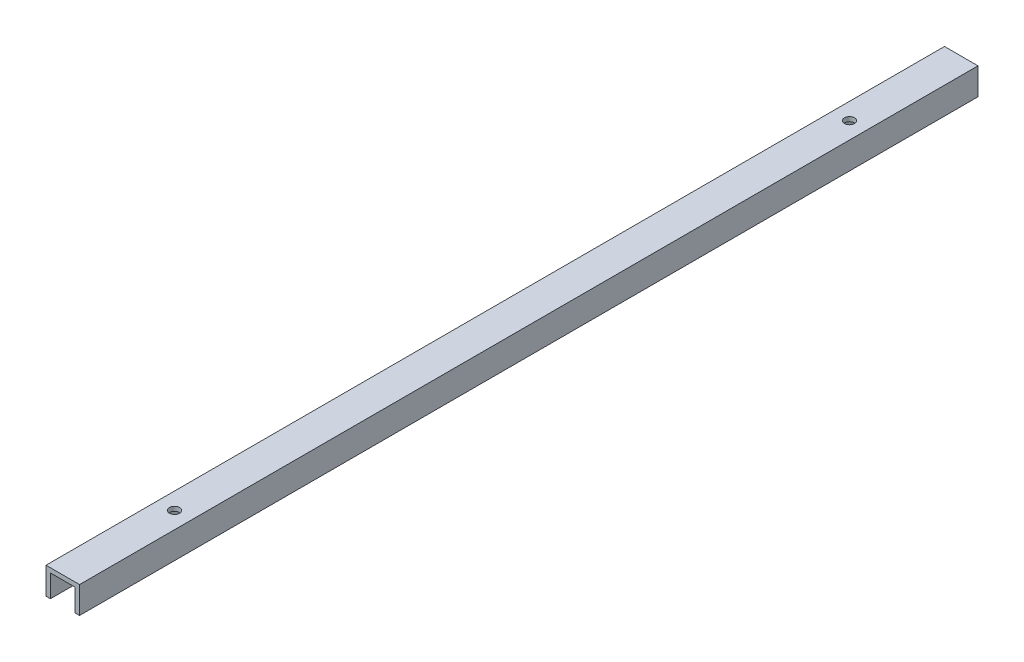
ISO-10303-21;
HEADER;
FILE_DESCRIPTION(('STEP AP214'),'2;1');
FILE_NAME('part.step','',(''),(''),'','','');
FILE_SCHEMA(('AUTOMOTIVE_DESIGN { 1 0 10303 214 1 1 1 1 }'));
ENDSEC;
DATA;
#1=APPLICATION_CONTEXT('core data for automotive mechanical design processes');
#2=APPLICATION_PROTOCOL_DEFINITION('international standard','automotive_design',2000,#1);
#3=PRODUCT_CONTEXT('',#1,'mechanical');
#4=PRODUCT('Part','Part','',(#3));
#5=PRODUCT_RELATED_PRODUCT_CATEGORY('part','',(#4));
#6=PRODUCT_DEFINITION_FORMATION('','',#4);
#7=PRODUCT_DEFINITION_CONTEXT('part definition',#1,'design');
#8=PRODUCT_DEFINITION('design','',#6,#7);
#9=PRODUCT_DEFINITION_SHAPE('','',#8);
#10=(LENGTH_UNIT() NAMED_UNIT(*) SI_UNIT(.MILLI.,.METRE.));
#11=(NAMED_UNIT(*) PLANE_ANGLE_UNIT() SI_UNIT($,.RADIAN.));
#12=(NAMED_UNIT(*) SI_UNIT($,.STERADIAN.) SOLID_ANGLE_UNIT());
#13=UNCERTAINTY_MEASURE_WITH_UNIT(LENGTH_MEASURE(1.E-05),#10,'distance_accuracy_value','');
#14=(GEOMETRIC_REPRESENTATION_CONTEXT(3) GLOBAL_UNCERTAINTY_ASSIGNED_CONTEXT((#13)) GLOBAL_UNIT_ASSIGNED_CONTEXT((#10,
#11,#12)) REPRESENTATION_CONTEXT('',''));
#15=CARTESIAN_POINT('',(0.,0.,0.));
#16=DIRECTION('',(0.,0.,1.));
#17=DIRECTION('',(1.,0.,0.));
#18=AXIS2_PLACEMENT_3D('',#15,#16,#17);
#19=CARTESIAN_POINT('',(0.,10.,-402.));
#20=DIRECTION('',(1.,0.,0.));
#21=DIRECTION('',(0.,1.,0.));
#22=AXIS2_PLACEMENT_3D('',#19,#20,#21);
#23=PLANE('',#22);
#24=DIRECTION('',(0.,1.,0.));
#25=VECTOR('',#24,1.);
#26=CARTESIAN_POINT('',(0.,10.,0.));
#27=LINE('',#26,#25);
#28=CARTESIAN_POINT('',(0.,0.,0.));
#29=VERTEX_POINT('',#28);
#30=CARTESIAN_POINT('',(0.,10.,0.));
#31=VERTEX_POINT('',#30);
#32=EDGE_CURVE('E137',#29,#31,#27,.T.);
#33=ORIENTED_EDGE('',*,*,#32,.F.);
#34=DIRECTION('',(0.,0.,1.));
#35=VECTOR('',#34,1.);
#36=CARTESIAN_POINT('',(0.,0.,-402.));
#37=LINE('',#36,#35);
#38=CARTESIAN_POINT('',(0.,0.,-402.));
#39=VERTEX_POINT('',#38);
#40=EDGE_CURVE('E11',#39,#29,#37,.T.);
#41=ORIENTED_EDGE('',*,*,#40,.F.);
#42=DIRECTION('',(0.,1.,0.));
#43=VECTOR('',#42,1.);
#44=CARTESIAN_POINT('',(0.,10.,-402.));
#45=LINE('',#44,#43);
#46=CARTESIAN_POINT('',(0.,10.,-402.));
#47=VERTEX_POINT('',#46);
#48=EDGE_CURVE('E158',#39,#47,#45,.T.);
#49=ORIENTED_EDGE('',*,*,#48,.T.);
#50=DIRECTION('',(0.,0.,1.));
#51=VECTOR('',#50,1.);
#52=CARTESIAN_POINT('',(0.,10.,-402.));
#53=LINE('',#52,#51);
#54=EDGE_CURVE('E95',#47,#31,#53,.T.);
#55=ORIENTED_EDGE('',*,*,#54,.T.);
#56=EDGE_LOOP('',(#33,#41,#49,#55));
#57=FACE_BOUND('',#56,.T.);
#58=ADVANCED_FACE('F39',(#57),#23,.T.);
#59=CARTESIAN_POINT('',(0.,0.,-402.));
#60=DIRECTION('',(0.,-1.,0.));
#61=DIRECTION('',(1.,0.,0.));
#62=AXIS2_PLACEMENT_3D('',#59,#60,#61);
#63=PLANE('',#62);
#64=DIRECTION('',(1.,0.,0.));
#65=VECTOR('',#64,1.);
#66=CARTESIAN_POINT('',(0.,0.,0.));
#67=LINE('',#66,#65);
#68=CARTESIAN_POINT('',(-2.,0.,0.));
#69=VERTEX_POINT('',#68);
#70=EDGE_CURVE('E156',#69,#29,#67,.T.);
#71=ORIENTED_EDGE('',*,*,#70,.F.);
#72=DIRECTION('',(0.,0.,1.));
#73=VECTOR('',#72,1.);
#74=CARTESIAN_POINT('',(-2.,0.,-402.));
#75=LINE('',#74,#73);
#76=CARTESIAN_POINT('',(-2.,0.,-402.));
#77=VERTEX_POINT('',#76);
#78=EDGE_CURVE('E48',#77,#69,#75,.T.);
#79=ORIENTED_EDGE('',*,*,#78,.F.);
#80=DIRECTION('',(1.,0.,0.));
#81=VECTOR('',#80,1.);
#82=CARTESIAN_POINT('',(0.,0.,-402.));
#83=LINE('',#82,#81);
#84=EDGE_CURVE('E127',#77,#39,#83,.T.);
#85=ORIENTED_EDGE('',*,*,#84,.T.);
#86=ORIENTED_EDGE('',*,*,#40,.T.);
#87=EDGE_LOOP('',(#71,#79,#85,#86));
#88=FACE_BOUND('',#87,.T.);
#89=ADVANCED_FACE('F198',(#88),#63,.T.);
#90=CARTESIAN_POINT('',(-2.,0.,-402.));
#91=DIRECTION('',(-1.,0.,0.));
#92=DIRECTION('',(0.,0.,1.));
#93=AXIS2_PLACEMENT_3D('',#90,#91,#92);
#94=PLANE('',#93);
#95=DIRECTION('',(0.,-1.,0.));
#96=VECTOR('',#95,1.);
#97=CARTESIAN_POINT('',(-2.,0.,0.));
#98=LINE('',#97,#96);
#99=CARTESIAN_POINT('',(-2.,12.,0.));
#100=VERTEX_POINT('',#99);
#101=EDGE_CURVE('E114',#100,#69,#98,.T.);
#102=ORIENTED_EDGE('',*,*,#101,.F.);
#103=DIRECTION('',(0.,0.,1.));
#104=VECTOR('',#103,1.);
#105=CARTESIAN_POINT('',(-2.,12.,-402.));
#106=LINE('',#105,#104);
#107=CARTESIAN_POINT('',(-2.,12.,-402.));
#108=VERTEX_POINT('',#107);
#109=EDGE_CURVE('E109',#108,#100,#106,.T.);
#110=ORIENTED_EDGE('',*,*,#109,.F.);
#111=DIRECTION('',(0.,-1.,0.));
#112=VECTOR('',#111,1.);
#113=CARTESIAN_POINT('',(-2.,0.,-402.));
#114=LINE('',#113,#112);
#115=EDGE_CURVE('E112',#108,#77,#114,.T.);
#116=ORIENTED_EDGE('',*,*,#115,.T.);
#117=ORIENTED_EDGE('',*,*,#78,.T.);
#118=EDGE_LOOP('',(#102,#110,#116,#117));
#119=FACE_BOUND('',#118,.T.);
#120=ADVANCED_FACE('F111',(#119),#94,.T.);
#121=CARTESIAN_POINT('',(-2.,12.,-402.));
#122=DIRECTION('',(0.,1.,0.));
#123=DIRECTION('',(0.,0.,1.));
#124=AXIS2_PLACEMENT_3D('',#121,#122,#123);
#125=PLANE('',#124);
#126=CARTESIAN_POINT('',(5.5,12.,-352.));
#127=DIRECTION('',(0.,1.,0.));
#128=DIRECTION('',(0.,0.,1.));
#129=AXIS2_PLACEMENT_3D('',#126,#127,#128);
#130=CIRCLE('',#129,2.25);
#131=CARTESIAN_POINT('',(5.5,12.,-349.75));
#132=VERTEX_POINT('',#131);
#133=EDGE_CURVE('E177',#132,#132,#130,.T.);
#134=ORIENTED_EDGE('',*,*,#133,.F.);
#135=EDGE_LOOP('',(#134));
#136=FACE_BOUND('',#135,.T.);
#137=CARTESIAN_POINT('',(5.5,12.,-50.));
#138=DIRECTION('',(0.,1.,0.));
#139=DIRECTION('',(0.,0.,1.));
#140=AXIS2_PLACEMENT_3D('',#137,#138,#139);
#141=CIRCLE('',#140,2.25);
#142=CARTESIAN_POINT('',(5.5,12.,-47.75));
#143=VERTEX_POINT('',#142);
#144=EDGE_CURVE('E169',#143,#143,#141,.T.);
#145=ORIENTED_EDGE('',*,*,#144,.F.);
#146=EDGE_LOOP('',(#145));
#147=FACE_BOUND('',#146,.T.);
#148=DIRECTION('',(-1.,0.,0.));
#149=VECTOR('',#148,1.);
#150=CARTESIAN_POINT('',(-2.,12.,0.));
#151=LINE('',#150,#149);
#152=CARTESIAN_POINT('',(13.,12.,0.));
#153=VERTEX_POINT('',#152);
#154=EDGE_CURVE('E153',#153,#100,#151,.T.);
#155=ORIENTED_EDGE('',*,*,#154,.F.);
#156=DIRECTION('',(0.,0.,1.));
#157=VECTOR('',#156,1.);
#158=CARTESIAN_POINT('',(13.,12.,-402.));
#159=LINE('',#158,#157);
#160=CARTESIAN_POINT('',(13.,12.,-402.));
#161=VERTEX_POINT('',#160);
#162=EDGE_CURVE('E119',#161,#153,#159,.T.);
#163=ORIENTED_EDGE('',*,*,#162,.F.);
#164=DIRECTION('',(-1.,0.,0.));
#165=VECTOR('',#164,1.);
#166=CARTESIAN_POINT('',(-2.,12.,-402.));
#167=LINE('',#166,#165);
#168=EDGE_CURVE('E125',#161,#108,#167,.T.);
#169=ORIENTED_EDGE('',*,*,#168,.T.);
#170=ORIENTED_EDGE('',*,*,#109,.T.);
#171=EDGE_LOOP('',(#155,#163,#169,#170));
#172=FACE_BOUND('',#171,.T.);
#173=ADVANCED_FACE('F129',(#136,#147,#172),#125,.T.);
#174=CARTESIAN_POINT('',(13.,12.,-402.));
#175=DIRECTION('',(1.,0.,0.));
#176=DIRECTION('',(0.,0.,-1.));
#177=AXIS2_PLACEMENT_3D('',#174,#175,#176);
#178=PLANE('',#177);
#179=DIRECTION('',(0.,1.,0.));
#180=VECTOR('',#179,1.);
#181=CARTESIAN_POINT('',(13.,12.,0.));
#182=LINE('',#181,#180);
#183=CARTESIAN_POINT('',(13.,0.,0.));
#184=VERTEX_POINT('',#183);
#185=EDGE_CURVE('E150',#184,#153,#182,.T.);
#186=ORIENTED_EDGE('',*,*,#185,.F.);
#187=DIRECTION('',(0.,0.,1.));
#188=VECTOR('',#187,1.);
#189=CARTESIAN_POINT('',(13.,0.,-402.));
#190=LINE('',#189,#188);
#191=CARTESIAN_POINT('',(13.,0.,-402.));
#192=VERTEX_POINT('',#191);
#193=EDGE_CURVE('E162',#192,#184,#190,.T.);
#194=ORIENTED_EDGE('',*,*,#193,.F.);
#195=DIRECTION('',(0.,1.,0.));
#196=VECTOR('',#195,1.);
#197=CARTESIAN_POINT('',(13.,12.,-402.));
#198=LINE('',#197,#196);
#199=EDGE_CURVE('E130',#192,#161,#198,.T.);
#200=ORIENTED_EDGE('',*,*,#199,.T.);
#201=ORIENTED_EDGE('',*,*,#162,.T.);
#202=EDGE_LOOP('',(#186,#194,#200,#201));
#203=FACE_BOUND('',#202,.T.);
#204=ADVANCED_FACE('F211',(#203),#178,.T.);
#205=CARTESIAN_POINT('',(13.,0.,-402.));
#206=DIRECTION('',(0.,-1.,0.));
#207=DIRECTION('',(0.,0.,-1.));
#208=AXIS2_PLACEMENT_3D('',#205,#206,#207);
#209=PLANE('',#208);
#210=DIRECTION('',(1.,0.,0.));
#211=VECTOR('',#210,1.);
#212=CARTESIAN_POINT('',(13.,0.,0.));
#213=LINE('',#212,#211);
#214=CARTESIAN_POINT('',(11.,0.,0.));
#215=VERTEX_POINT('',#214);
#216=EDGE_CURVE('E147',#215,#184,#213,.T.);
#217=ORIENTED_EDGE('',*,*,#216,.F.);
#218=DIRECTION('',(0.,0.,1.));
#219=VECTOR('',#218,1.);
#220=CARTESIAN_POINT('',(11.,0.,-402.));
#221=LINE('',#220,#219);
#222=CARTESIAN_POINT('',(11.,0.,-402.));
#223=VERTEX_POINT('',#222);
#224=EDGE_CURVE('E164',#223,#215,#221,.T.);
#225=ORIENTED_EDGE('',*,*,#224,.F.);
#226=DIRECTION('',(1.,0.,0.));
#227=VECTOR('',#226,1.);
#228=CARTESIAN_POINT('',(13.,0.,-402.));
#229=LINE('',#228,#227);
#230=EDGE_CURVE('E132',#223,#192,#229,.T.);
#231=ORIENTED_EDGE('',*,*,#230,.T.);
#232=ORIENTED_EDGE('',*,*,#193,.T.);
#233=EDGE_LOOP('',(#217,#225,#231,#232));
#234=FACE_BOUND('',#233,.T.);
#235=ADVANCED_FACE('F189',(#234),#209,.T.);
#236=CARTESIAN_POINT('',(11.,0.,-402.));
#237=DIRECTION('',(-1.,0.,0.));
#238=DIRECTION('',(0.,-1.,0.));
#239=AXIS2_PLACEMENT_3D('',#236,#237,#238);
#240=PLANE('',#239);
#241=DIRECTION('',(0.,-1.,0.));
#242=VECTOR('',#241,1.);
#243=CARTESIAN_POINT('',(11.,0.,0.));
#244=LINE('',#243,#242);
#245=CARTESIAN_POINT('',(11.,10.,0.));
#246=VERTEX_POINT('',#245);
#247=EDGE_CURVE('E144',#246,#215,#244,.T.);
#248=ORIENTED_EDGE('',*,*,#247,.F.);
#249=DIRECTION('',(0.,0.,1.));
#250=VECTOR('',#249,1.);
#251=CARTESIAN_POINT('',(11.,10.,-402.));
#252=LINE('',#251,#250);
#253=CARTESIAN_POINT('',(11.,10.,-402.));
#254=VERTEX_POINT('',#253);
#255=EDGE_CURVE('E166',#254,#246,#252,.T.);
#256=ORIENTED_EDGE('',*,*,#255,.F.);
#257=DIRECTION('',(0.,-1.,0.));
#258=VECTOR('',#257,1.);
#259=CARTESIAN_POINT('',(11.,0.,-402.));
#260=LINE('',#259,#258);
#261=EDGE_CURVE('E183',#254,#223,#260,.T.);
#262=ORIENTED_EDGE('',*,*,#261,.T.);
#263=ORIENTED_EDGE('',*,*,#224,.T.);
#264=EDGE_LOOP('',(#248,#256,#262,#263));
#265=FACE_BOUND('',#264,.T.);
#266=ADVANCED_FACE('F194',(#265),#240,.T.);
#267=CARTESIAN_POINT('',(0.,10.,-402.));
#268=DIRECTION('',(0.,-1.,0.));
#269=DIRECTION('',(0.,0.,-1.));
#270=AXIS2_PLACEMENT_3D('',#267,#268,#269);
#271=PLANE('',#270);
#272=CARTESIAN_POINT('',(5.5,10.,-352.));
#273=DIRECTION('',(0.,-1.,0.));
#274=DIRECTION('',(0.,0.,-1.));
#275=AXIS2_PLACEMENT_3D('',#272,#273,#274);
#276=CIRCLE('',#275,2.25);
#277=CARTESIAN_POINT('',(5.5,10.,-354.25));
#278=VERTEX_POINT('',#277);
#279=EDGE_CURVE('E42',#278,#278,#276,.T.);
#280=ORIENTED_EDGE('',*,*,#279,.F.);
#281=EDGE_LOOP('',(#280));
#282=FACE_BOUND('',#281,.T.);
#283=CARTESIAN_POINT('',(5.5,10.,-50.));
#284=DIRECTION('',(0.,-1.,0.));
#285=DIRECTION('',(0.,0.,-1.));
#286=AXIS2_PLACEMENT_3D('',#283,#284,#285);
#287=CIRCLE('',#286,2.25);
#288=CARTESIAN_POINT('',(5.5,10.,-52.25));
#289=VERTEX_POINT('',#288);
#290=EDGE_CURVE('E141',#289,#289,#287,.T.);
#291=ORIENTED_EDGE('',*,*,#290,.F.);
#292=EDGE_LOOP('',(#291));
#293=FACE_BOUND('',#292,.T.);
#294=DIRECTION('',(1.,0.,0.));
#295=VECTOR('',#294,1.);
#296=CARTESIAN_POINT('',(0.,10.,0.));
#297=LINE('',#296,#295);
#298=EDGE_CURVE('E140',#31,#246,#297,.T.);
#299=ORIENTED_EDGE('',*,*,#298,.F.);
#300=ORIENTED_EDGE('',*,*,#54,.F.);
#301=DIRECTION('',(1.,0.,0.));
#302=VECTOR('',#301,1.);
#303=CARTESIAN_POINT('',(0.,10.,-402.));
#304=LINE('',#303,#302);
#305=EDGE_CURVE('E181',#47,#254,#304,.T.);
#306=ORIENTED_EDGE('',*,*,#305,.T.);
#307=ORIENTED_EDGE('',*,*,#255,.T.);
#308=EDGE_LOOP('',(#299,#300,#306,#307));
#309=FACE_BOUND('',#308,.T.);
#310=ADVANCED_FACE('F195',(#282,#293,#309),#271,.T.);
#311=CARTESIAN_POINT('',(0.,0.,-402.));
#312=DIRECTION('',(0.,0.,-1.));
#313=DIRECTION('',(-1.,0.,0.));
#314=AXIS2_PLACEMENT_3D('',#311,#312,#313);
#315=PLANE('',#314);
#316=ORIENTED_EDGE('',*,*,#48,.F.);
#317=ORIENTED_EDGE('',*,*,#84,.F.);
#318=ORIENTED_EDGE('',*,*,#115,.F.);
#319=ORIENTED_EDGE('',*,*,#168,.F.);
#320=ORIENTED_EDGE('',*,*,#199,.F.);
#321=ORIENTED_EDGE('',*,*,#230,.F.);
#322=ORIENTED_EDGE('',*,*,#261,.F.);
#323=ORIENTED_EDGE('',*,*,#305,.F.);
#324=EDGE_LOOP('',(#316,#317,#318,#319,#320,#321,#322,#323));
#325=FACE_BOUND('',#324,.T.);
#326=ADVANCED_FACE('F123',(#325),#315,.T.);
#327=CARTESIAN_POINT('',(0.,0.,0.));
#328=DIRECTION('',(0.,0.,-1.));
#329=DIRECTION('',(-1.,0.,0.));
#330=AXIS2_PLACEMENT_3D('',#327,#328,#329);
#331=PLANE('',#330);
#332=ORIENTED_EDGE('',*,*,#32,.T.);
#333=ORIENTED_EDGE('',*,*,#298,.T.);
#334=ORIENTED_EDGE('',*,*,#247,.T.);
#335=ORIENTED_EDGE('',*,*,#216,.T.);
#336=ORIENTED_EDGE('',*,*,#185,.T.);
#337=ORIENTED_EDGE('',*,*,#154,.T.);
#338=ORIENTED_EDGE('',*,*,#101,.T.);
#339=ORIENTED_EDGE('',*,*,#70,.T.);
#340=EDGE_LOOP('',(#332,#333,#334,#335,#336,#337,#338,#339));
#341=FACE_BOUND('',#340,.T.);
#342=ADVANCED_FACE('F197',(#341),#331,.F.);
#343=CARTESIAN_POINT('',(5.5,0.,-50.));
#344=DIRECTION('',(0.,1.,0.));
#345=DIRECTION('',(0.,0.,1.));
#346=AXIS2_PLACEMENT_3D('',#343,#344,#345);
#347=CYLINDRICAL_SURFACE('',#346,2.25);
#348=ORIENTED_EDGE('',*,*,#290,.T.);
#349=EDGE_LOOP('',(#348));
#350=FACE_BOUND('',#349,.T.);
#351=ORIENTED_EDGE('',*,*,#144,.T.);
#352=EDGE_LOOP('',(#351));
#353=FACE_BOUND('',#352,.T.);
#354=ADVANCED_FACE('F230',(#350,#353),#347,.F.);
#355=CARTESIAN_POINT('',(5.5,0.,-352.));
#356=DIRECTION('',(0.,1.,0.));
#357=DIRECTION('',(0.,0.,1.));
#358=AXIS2_PLACEMENT_3D('',#355,#356,#357);
#359=CYLINDRICAL_SURFACE('',#358,2.25);
#360=ORIENTED_EDGE('',*,*,#279,.T.);
#361=EDGE_LOOP('',(#360));
#362=FACE_BOUND('',#361,.T.);
#363=ORIENTED_EDGE('',*,*,#133,.T.);
#364=EDGE_LOOP('',(#363));
#365=FACE_BOUND('',#364,.T.);
#366=ADVANCED_FACE('F227',(#362,#365),#359,.F.);
#367=CLOSED_SHELL('',(#58,#89,#120,#173,#204,#235,#266,#310,#326,#342,#354,#366));
#368=MANIFOLD_SOLID_BREP('B2',#367);
#369=ADVANCED_BREP_SHAPE_REPRESENTATION('',(#18,#368),#14);
#370=SHAPE_DEFINITION_REPRESENTATION(#9,#369);
ENDSEC;
END-ISO-10303-21;
